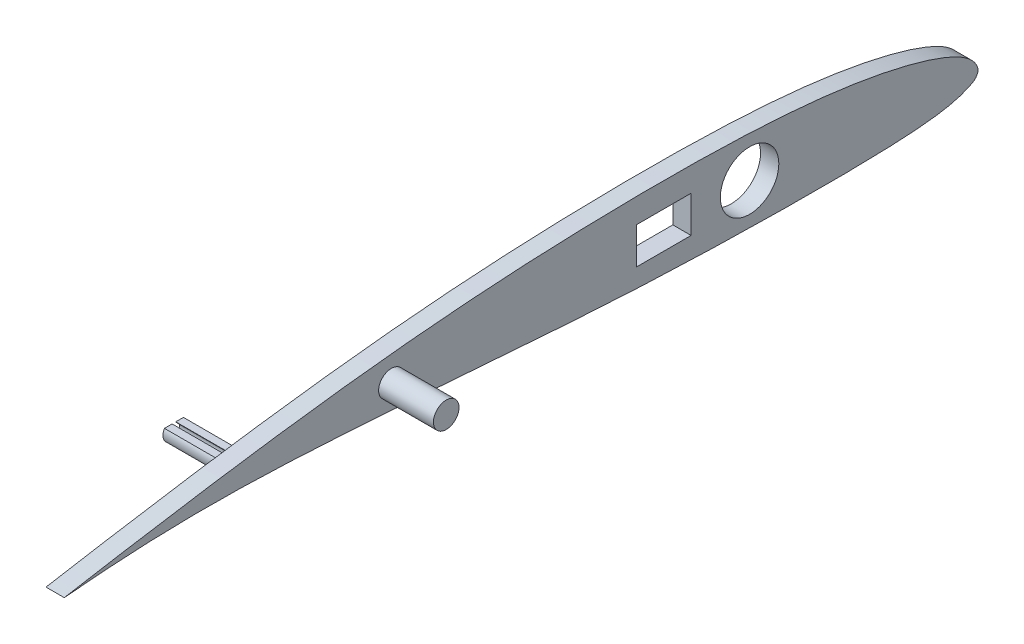
ISO-10303-21;
HEADER;
FILE_DESCRIPTION(('STEP AP214'),'2;1');
FILE_NAME('part.step','',(''),(''),'','','');
FILE_SCHEMA(('AUTOMOTIVE_DESIGN { 1 0 10303 214 1 1 1 1 }'));
ENDSEC;
DATA;
#1=APPLICATION_CONTEXT('core data for automotive mechanical design processes');
#2=APPLICATION_PROTOCOL_DEFINITION('international standard','automotive_design',2000,#1);
#3=PRODUCT_CONTEXT('',#1,'mechanical');
#4=PRODUCT('Part','Part','',(#3));
#5=PRODUCT_RELATED_PRODUCT_CATEGORY('part','',(#4));
#6=PRODUCT_DEFINITION_FORMATION('','',#4);
#7=PRODUCT_DEFINITION_CONTEXT('part definition',#1,'design');
#8=PRODUCT_DEFINITION('design','',#6,#7);
#9=PRODUCT_DEFINITION_SHAPE('','',#8);
#10=(LENGTH_UNIT() NAMED_UNIT(*) SI_UNIT(.MILLI.,.METRE.));
#11=(NAMED_UNIT(*) PLANE_ANGLE_UNIT() SI_UNIT($,.RADIAN.));
#12=(NAMED_UNIT(*) SI_UNIT($,.STERADIAN.) SOLID_ANGLE_UNIT());
#13=UNCERTAINTY_MEASURE_WITH_UNIT(LENGTH_MEASURE(1.E-05),#10,'distance_accuracy_value','');
#14=(GEOMETRIC_REPRESENTATION_CONTEXT(3) GLOBAL_UNCERTAINTY_ASSIGNED_CONTEXT((#13)) GLOBAL_UNIT_ASSIGNED_CONTEXT((#10,
#11,#12)) REPRESENTATION_CONTEXT('',''));
#15=CARTESIAN_POINT('',(0.,0.,0.));
#16=DIRECTION('',(0.,0.,1.));
#17=DIRECTION('',(1.,0.,0.));
#18=AXIS2_PLACEMENT_3D('',#15,#16,#17);
#19=CARTESIAN_POINT('',(5.,1.49711132773622,0.435092083404368));
#20=DIRECTION('',(-1.,0.,0.));
#21=DIRECTION('',(0.,0.,1.));
#22=AXIS2_PLACEMENT_3D('',#19,#20,#21);
#23=PLANE('',#22);
#24=CARTESIAN_POINT('',(5.,6.07732270373844,160.499919709394));
#25=DIRECTION('',(-1.,0.,0.));
#26=DIRECTION('',(0.,0.,1.));
#27=AXIS2_PLACEMENT_3D('',#24,#25,#26);
#28=CIRCLE('',#27,3.49999999999999);
#29=CARTESIAN_POINT('',(5.,6.07732270373844,163.999919709394));
#30=VERTEX_POINT('',#29);
#31=EDGE_CURVE('E228',#30,#30,#28,.T.);
#32=ORIENTED_EDGE('',*,*,#31,.T.);
#33=EDGE_LOOP('',(#32));
#34=FACE_BOUND('',#33,.T.);
#35=CARTESIAN_POINT('',(5.,5.07732270373844,62.4999197093942));
#36=DIRECTION('',(1.,0.,0.));
#37=DIRECTION('',(0.,0.,-1.));
#38=AXIS2_PLACEMENT_3D('',#35,#36,#37);
#39=CIRCLE('',#38,8.);
#40=CARTESIAN_POINT('',(5.,5.07732270373844,54.4999197093942));
#41=VERTEX_POINT('',#40);
#42=EDGE_CURVE('E263',#41,#41,#39,.T.);
#43=ORIENTED_EDGE('',*,*,#42,.F.);
#44=EDGE_LOOP('',(#43));
#45=FACE_BOUND('',#44,.T.);
#46=CARTESIAN_POINT('',(5.,0.,250.));
#47=CARTESIAN_POINT('',(5.,-0.0080427959719715,250.000228293678));
#48=CARTESIAN_POINT('',(5.,0.172375657967406,248.284955515532));
#49=CARTESIAN_POINT('',(5.,0.308690014795419,246.518112419387));
#50=CARTESIAN_POINT('',(5.,0.685693593852336,242.189387343398));
#51=CARTESIAN_POINT('',(5.,1.07410152891603,236.806461263496));
#52=CARTESIAN_POINT('',(5.,1.49731723995003,229.680385951639));
#53=CARTESIAN_POINT('',(5.,1.8232186026768,221.18415869828));
#54=CARTESIAN_POINT('',(5.,1.96762610068065,211.337618207726));
#55=CARTESIAN_POINT('',(5.,1.83322105638369,200.371188527109));
#56=CARTESIAN_POINT('',(5.,1.38960528984164,188.499913622482));
#57=CARTESIAN_POINT('',(5.,0.706014078000893,175.953687417433));
#58=CARTESIAN_POINT('',(5.,-0.160208641561513,162.931424917666));
#59=CARTESIAN_POINT('',(5.,-1.14801632724376,149.615771743617));
#60=CARTESIAN_POINT('',(5.,-2.19092490983926,136.176354994724));
#61=CARTESIAN_POINT('',(5.,-3.21958397917046,122.767140548026));
#62=CARTESIAN_POINT('',(5.,-4.15274312671142,109.520053587455));
#63=CARTESIAN_POINT('',(5.,-4.93856436487493,96.5460959745437));
#64=CARTESIAN_POINT('',(5.,-5.53683070268675,83.9408193016427));
#65=CARTESIAN_POINT('',(5.,-5.94764820461108,71.8018392906514));
#66=CARTESIAN_POINT('',(5.,-6.21845093878312,60.2452560030716));
#67=CARTESIAN_POINT('',(5.,-6.35536975583973,49.3987328907547));
#68=CARTESIAN_POINT('',(5.,-6.38138796281789,39.3972261942655));
#69=CARTESIAN_POINT('',(5.,-6.26504923032313,30.3619348419668));
#70=CARTESIAN_POINT('',(5.,-6.01216491688521,22.4121811031587));
#71=CARTESIAN_POINT('',(5.,-5.59743390072595,15.6262272306516));
#72=CARTESIAN_POINT('',(5.,-4.92870657935606,10.0719075109048));
#73=CARTESIAN_POINT('',(5.,-4.04044698146404,5.69769261214423));
#74=CARTESIAN_POINT('',(5.,-2.8657529844069,2.62532063874475));
#75=CARTESIAN_POINT('',(5.,-1.7115284699546,0.494884225045661));
#76=CARTESIAN_POINT('',(5.,-0.410454230626488,-0.0213125491030087));
#77=CARTESIAN_POINT('',(5.,0.792659826704065,0.0311691995850224));
#78=CARTESIAN_POINT('',(5.,2.30568433693192,0.812599241892923));
#79=CARTESIAN_POINT('',(5.,4.23835242447377,2.72886351673443));
#80=CARTESIAN_POINT('',(5.,6.11817212106947,5.76990724125498));
#81=CARTESIAN_POINT('',(5.,7.91359420170391,9.88094280419771));
#82=CARTESIAN_POINT('',(5.,9.64131817838287,15.0749304677094));
#83=CARTESIAN_POINT('',(5.,11.2838964878058,21.2987522216172));
#84=CARTESIAN_POINT('',(5.,12.7883817585812,28.4971721202648));
#85=CARTESIAN_POINT('',(5.,14.0978349081275,36.6073734062479));
#86=CARTESIAN_POINT('',(5.,15.1594290171638,45.573028440303));
#87=CARTESIAN_POINT('',(5.,15.9609039979753,55.3329100744701));
#88=CARTESIAN_POINT('',(5.,16.4940697383882,65.8165364983871));
#89=CARTESIAN_POINT('',(5.,16.7919897051422,76.9313762604552));
#90=CARTESIAN_POINT('',(5.,16.864754130909,88.5669490281142));
#91=CARTESIAN_POINT('',(5.,16.7267152914356,100.596999885542));
#92=CARTESIAN_POINT('',(5.,16.3833850637257,112.888825982424));
#93=CARTESIAN_POINT('',(5.,15.825573666627,125.31161581915));
#94=CARTESIAN_POINT('',(5.,15.0523318700684,137.743791097076));
#95=CARTESIAN_POINT('',(5.,14.0593390742259,150.072384382085));
#96=CARTESIAN_POINT('',(5.,12.8815869860292,162.191375055682));
#97=CARTESIAN_POINT('',(5.,11.5492803460744,173.989074322246));
#98=CARTESIAN_POINT('',(5.,10.1162497290333,185.35236444642));
#99=CARTESIAN_POINT('',(5.,8.63237912523508,196.163081697706));
#100=CARTESIAN_POINT('',(5.,7.13151388385034,206.300441402258));
#101=CARTESIAN_POINT('',(5.,5.73122176805054,215.560350587015));
#102=CARTESIAN_POINT('',(5.,4.29329512716244,223.97715704258));
#103=CARTESIAN_POINT('',(5.,3.1818088737293,231.363413336396));
#104=CARTESIAN_POINT('',(5.,2.09894241729889,237.746440904332));
#105=CARTESIAN_POINT('',(5.,1.2458619166603,242.622069365861));
#106=CARTESIAN_POINT('',(5.,0.552864946230777,246.64452933247));
#107=CARTESIAN_POINT('',(5.,0.246216764640028,248.328398440367));
#108=CARTESIAN_POINT('',(5.,0.00797737724443801,249.999773563223));
#109=CARTESIAN_POINT('',(5.,0.,250.));
#110=B_SPLINE_CURVE_WITH_KNOTS('',3,(#46,#47,#48,#49,#50,#51,#52,#53,#54,#55,#56,#57,#58,#59,
#60,#61,#62,#63,#64,#65,#66,#67,#68,#69,#70,#71,#72,#73,#74,#75,#76,#77,#78,#79,#80,#81,#82,#83,
#84,#85,#86,#87,#88,#89,#90,#91,#92,#93,#94,#95,#96,#97,#98,#99,#100,#101,#102,#103,#104,#105,
#106,#107,#108,#109),.UNSPECIFIED.,.T.,.F.,(4,1,1,1,1,1,1,1,1,1,1,1,1,1,1,1,1,1,1,1,1,1,1,1,1,1,
1,1,1,1,1,1,1,1,1,1,1,1,1,1,1,1,1,1,1,1,1,1,1,1,1,1,1,1,1,1,1,1,1,1,1,4),(0.,
0.00158888881614516,0.00632921783555629,0.0142024564897436,0.0251728077530557,
0.0391734833267743,0.0560606311759249,0.0755789238487882,0.0973636066296903,0.120926258366677,
0.145825281006277,0.171670911815127,0.198108536705041,0.22479018357162,0.25139057978404,
0.277643490654311,0.303326750051388,0.328257458029316,0.352272548115194,0.375156061746876,
0.396620664402003,0.416422729294005,0.434304420097656,0.450054679859308,0.463465465082325,
0.474478994238096,0.483169222153171,0.489678354497499,0.494104066315722,0.496910015324886,
0.497289784891853,0.501214273282496,0.506457950332762,0.51335695674223,0.522168631834455,
0.53296596992453,0.545689209241574,0.56022077890382,0.57643892310517,0.594258689005965,
0.613600244568652,0.634342385932902,0.656331109263004,0.679351893859712,0.703152302846811,
0.727478208080039,0.7520707394079,0.776691163534608,0.801140183976245,0.825214386971546,
0.848697423570622,0.871352857669295,0.892947448931157,0.913230871058069,0.931955467148994,
0.94834206907442,0.963693004275676,0.976235918239566,0.986320058750392,0.993788799349345,
0.998424034933867,1.),.UNSPECIFIED.);
#111=CARTESIAN_POINT('',(5.,0.,250.));
#112=VERTEX_POINT('',#111);
#113=EDGE_CURVE('E268',#112,#112,#110,.T.);
#114=ORIENTED_EDGE('',*,*,#113,.T.);
#115=EDGE_LOOP('',(#114));
#116=FACE_BOUND('',#115,.T.);
#117=DIRECTION('',(0.,1.,0.));
#118=VECTOR('',#117,1.);
#119=CARTESIAN_POINT('',(5.,10.0773227037384,78.4999197093942));
#120=LINE('',#119,#118);
#121=CARTESIAN_POINT('',(5.,0.0773227037384437,78.4999197093942));
#122=VERTEX_POINT('',#121);
#123=CARTESIAN_POINT('',(5.,10.0773227037384,78.4999197093942));
#124=VERTEX_POINT('',#123);
#125=EDGE_CURVE('E232',#122,#124,#120,.T.);
#126=ORIENTED_EDGE('',*,*,#125,.F.);
#127=DIRECTION('',(0.,0.,-1.));
#128=VECTOR('',#127,1.);
#129=CARTESIAN_POINT('',(5.,0.0773227037384437,78.4999197093942));
#130=LINE('',#129,#128);
#131=CARTESIAN_POINT('',(5.,0.0773227037384437,93.4999197093942));
#132=VERTEX_POINT('',#131);
#133=EDGE_CURVE('E240',#132,#122,#130,.T.);
#134=ORIENTED_EDGE('',*,*,#133,.F.);
#135=DIRECTION('',(0.,-1.,0.));
#136=VECTOR('',#135,1.);
#137=CARTESIAN_POINT('',(5.,10.0773227037384,93.4999197093942));
#138=LINE('',#137,#136);
#139=CARTESIAN_POINT('',(5.,10.0773227037384,93.4999197093942));
#140=VERTEX_POINT('',#139);
#141=EDGE_CURVE('E237',#140,#132,#138,.T.);
#142=ORIENTED_EDGE('',*,*,#141,.F.);
#143=DIRECTION('',(0.,0.,1.));
#144=VECTOR('',#143,1.);
#145=CARTESIAN_POINT('',(5.,10.0773227037384,78.4999197093942));
#146=LINE('',#145,#144);
#147=EDGE_CURVE('E234',#124,#140,#146,.T.);
#148=ORIENTED_EDGE('',*,*,#147,.F.);
#149=EDGE_LOOP('',(#126,#134,#142,#148));
#150=FACE_BOUND('',#149,.T.);
#151=ADVANCED_FACE('F32',(#34,#45,#116,#150),#23,.F.);
#152=CARTESIAN_POINT('',(0.,1.49711132773622,0.435092083404368));
#153=DIRECTION('',(-1.,0.,0.));
#154=DIRECTION('',(0.,0.,1.));
#155=AXIS2_PLACEMENT_3D('',#152,#153,#154);
#156=PLANE('',#155);
#157=CARTESIAN_POINT('',(0.,4.91748058964991,200.));
#158=DIRECTION('',(-1.,0.,0.));
#159=DIRECTION('',(0.,0.,1.));
#160=AXIS2_PLACEMENT_3D('',#157,#158,#159);
#161=CIRCLE('',#160,2.99999999999999);
#162=CARTESIAN_POINT('',(0.,6.41748058964991,197.401923788647));
#163=VERTEX_POINT('',#162);
#164=CARTESIAN_POINT('',(0.,3.41748058964991,197.401923788647));
#165=VERTEX_POINT('',#164);
#166=EDGE_CURVE('E11',#163,#165,#161,.T.);
#167=ORIENTED_EDGE('',*,*,#166,.F.);
#168=DIRECTION('',(0.,0.,-1.));
#169=VECTOR('',#168,1.);
#170=CARTESIAN_POINT('',(0.,6.41748058964975,0.435092083404364));
#171=LINE('',#170,#169);
#172=CARTESIAN_POINT('',(0.,6.41748058964991,199.5));
#173=VERTEX_POINT('',#172);
#174=EDGE_CURVE('E148',#173,#163,#171,.T.);
#175=ORIENTED_EDGE('',*,*,#174,.F.);
#176=DIRECTION('',(0.,1.,0.));
#177=VECTOR('',#176,1.);
#178=CARTESIAN_POINT('',(0.,1.49711132773622,199.5));
#179=LINE('',#178,#177);
#180=CARTESIAN_POINT('',(0.,6.33169415202301,199.5));
#181=VERTEX_POINT('',#180);
#182=EDGE_CURVE('E303',#181,#173,#179,.T.);
#183=ORIENTED_EDGE('',*,*,#182,.F.);
#184=CARTESIAN_POINT('',(0.,4.91748058964991,200.));
#185=DIRECTION('',(-1.,0.,0.));
#186=DIRECTION('',(0.,0.,1.));
#187=AXIS2_PLACEMENT_3D('',#184,#185,#186);
#188=CIRCLE('',#187,1.5);
#189=CARTESIAN_POINT('',(0.,3.50326702727681,199.5));
#190=VERTEX_POINT('',#189);
#191=EDGE_CURVE('E306',#190,#181,#188,.F.);
#192=ORIENTED_EDGE('',*,*,#191,.F.);
#193=DIRECTION('',(0.,1.,0.));
#194=VECTOR('',#193,1.);
#195=CARTESIAN_POINT('',(0.,1.49711132773622,199.5));
#196=LINE('',#195,#194);
#197=CARTESIAN_POINT('',(0.,3.41748058964991,199.5));
#198=VERTEX_POINT('',#197);
#199=EDGE_CURVE('E51',#198,#190,#196,.T.);
#200=ORIENTED_EDGE('',*,*,#199,.F.);
#201=DIRECTION('',(0.,0.,1.));
#202=VECTOR('',#201,1.);
#203=CARTESIAN_POINT('',(0.,3.41748058964983,0.435092083404368));
#204=LINE('',#203,#202);
#205=EDGE_CURVE('E41',#165,#198,#204,.T.);
#206=ORIENTED_EDGE('',*,*,#205,.F.);
#207=EDGE_LOOP('',(#167,#175,#183,#192,#200,#206));
#208=FACE_BOUND('',#207,.T.);
#209=CARTESIAN_POINT('',(0.,4.91748058964991,200.));
#210=DIRECTION('',(-1.,0.,0.));
#211=DIRECTION('',(0.,0.,1.));
#212=AXIS2_PLACEMENT_3D('',#209,#210,#211);
#213=CIRCLE('',#212,2.99999999999999);
#214=CARTESIAN_POINT('',(0.,3.41748058964991,202.598076211353));
#215=VERTEX_POINT('',#214);
#216=CARTESIAN_POINT('',(0.,6.41748058964991,202.598076211353));
#217=VERTEX_POINT('',#216);
#218=EDGE_CURVE('E299',#215,#217,#213,.T.);
#219=ORIENTED_EDGE('',*,*,#218,.F.);
#220=DIRECTION('',(0.,0.,1.));
#221=VECTOR('',#220,1.);
#222=CARTESIAN_POINT('',(0.,3.41748058965,0.435092083404369));
#223=LINE('',#222,#221);
#224=CARTESIAN_POINT('',(0.,3.41748058964991,200.5));
#225=VERTEX_POINT('',#224);
#226=EDGE_CURVE('E274',#225,#215,#223,.T.);
#227=ORIENTED_EDGE('',*,*,#226,.F.);
#228=DIRECTION('',(0.,-1.,0.));
#229=VECTOR('',#228,1.);
#230=CARTESIAN_POINT('',(0.,1.49711132773622,200.5));
#231=LINE('',#230,#229);
#232=CARTESIAN_POINT('',(0.,3.50326702727682,200.5));
#233=VERTEX_POINT('',#232);
#234=EDGE_CURVE('E287',#233,#225,#231,.T.);
#235=ORIENTED_EDGE('',*,*,#234,.F.);
#236=CARTESIAN_POINT('',(0.,4.91748058964991,200.));
#237=DIRECTION('',(-1.,0.,0.));
#238=DIRECTION('',(0.,0.,1.));
#239=AXIS2_PLACEMENT_3D('',#236,#237,#238);
#240=CIRCLE('',#239,1.5);
#241=CARTESIAN_POINT('',(0.,6.331694152023,200.5));
#242=VERTEX_POINT('',#241);
#243=EDGE_CURVE('E290',#242,#233,#240,.F.);
#244=ORIENTED_EDGE('',*,*,#243,.F.);
#245=DIRECTION('',(0.,-1.,0.));
#246=VECTOR('',#245,1.);
#247=CARTESIAN_POINT('',(0.,1.49711132773622,200.5));
#248=LINE('',#247,#246);
#249=CARTESIAN_POINT('',(0.,6.41748058964991,200.5));
#250=VERTEX_POINT('',#249);
#251=EDGE_CURVE('E293',#250,#242,#248,.T.);
#252=ORIENTED_EDGE('',*,*,#251,.F.);
#253=DIRECTION('',(0.,0.,-1.));
#254=VECTOR('',#253,1.);
#255=CARTESIAN_POINT('',(0.,6.41748058965008,0.435092083404372));
#256=LINE('',#255,#254);
#257=EDGE_CURVE('E296',#217,#250,#256,.T.);
#258=ORIENTED_EDGE('',*,*,#257,.F.);
#259=EDGE_LOOP('',(#219,#227,#235,#244,#252,#258));
#260=FACE_BOUND('',#259,.T.);
#261=CARTESIAN_POINT('',(0.,0.,250.));
#262=CARTESIAN_POINT('',(0.,-0.0080427959719715,250.000228293678));
#263=CARTESIAN_POINT('',(0.,0.172375657967406,248.284955515532));
#264=CARTESIAN_POINT('',(0.,0.308690014795419,246.518112419387));
#265=CARTESIAN_POINT('',(0.,0.685693593852336,242.189387343398));
#266=CARTESIAN_POINT('',(0.,1.07410152891603,236.806461263496));
#267=CARTESIAN_POINT('',(0.,1.49731723995003,229.680385951639));
#268=CARTESIAN_POINT('',(0.,1.8232186026768,221.18415869828));
#269=CARTESIAN_POINT('',(0.,1.96762610068065,211.337618207726));
#270=CARTESIAN_POINT('',(0.,1.83322105638369,200.371188527109));
#271=CARTESIAN_POINT('',(0.,1.38960528984164,188.499913622482));
#272=CARTESIAN_POINT('',(0.,0.706014078000893,175.953687417433));
#273=CARTESIAN_POINT('',(0.,-0.160208641561513,162.931424917666));
#274=CARTESIAN_POINT('',(0.,-1.14801632724376,149.615771743617));
#275=CARTESIAN_POINT('',(0.,-2.19092490983926,136.176354994724));
#276=CARTESIAN_POINT('',(0.,-3.21958397917046,122.767140548026));
#277=CARTESIAN_POINT('',(0.,-4.15274312671142,109.520053587455));
#278=CARTESIAN_POINT('',(0.,-4.93856436487493,96.5460959745437));
#279=CARTESIAN_POINT('',(0.,-5.53683070268675,83.9408193016427));
#280=CARTESIAN_POINT('',(0.,-5.94764820461108,71.8018392906514));
#281=CARTESIAN_POINT('',(0.,-6.21845093878312,60.2452560030716));
#282=CARTESIAN_POINT('',(0.,-6.35536975583973,49.3987328907547));
#283=CARTESIAN_POINT('',(0.,-6.38138796281789,39.3972261942655));
#284=CARTESIAN_POINT('',(0.,-6.26504923032313,30.3619348419668));
#285=CARTESIAN_POINT('',(0.,-6.01216491688521,22.4121811031587));
#286=CARTESIAN_POINT('',(0.,-5.59743390072595,15.6262272306516));
#287=CARTESIAN_POINT('',(0.,-4.92870657935606,10.0719075109048));
#288=CARTESIAN_POINT('',(0.,-4.04044698146404,5.69769261214423));
#289=CARTESIAN_POINT('',(0.,-2.8657529844069,2.62532063874475));
#290=CARTESIAN_POINT('',(0.,-1.7115284699546,0.494884225045661));
#291=CARTESIAN_POINT('',(0.,-0.410454230626488,-0.0213125491030087));
#292=CARTESIAN_POINT('',(0.,0.792659826704065,0.0311691995850224));
#293=CARTESIAN_POINT('',(0.,2.30568433693192,0.812599241892923));
#294=CARTESIAN_POINT('',(0.,4.23835242447377,2.72886351673443));
#295=CARTESIAN_POINT('',(0.,6.11817212106947,5.76990724125498));
#296=CARTESIAN_POINT('',(0.,7.91359420170391,9.88094280419771));
#297=CARTESIAN_POINT('',(0.,9.64131817838287,15.0749304677094));
#298=CARTESIAN_POINT('',(0.,11.2838964878058,21.2987522216172));
#299=CARTESIAN_POINT('',(0.,12.7883817585812,28.4971721202648));
#300=CARTESIAN_POINT('',(0.,14.0978349081275,36.6073734062479));
#301=CARTESIAN_POINT('',(0.,15.1594290171638,45.573028440303));
#302=CARTESIAN_POINT('',(0.,15.9609039979753,55.3329100744701));
#303=CARTESIAN_POINT('',(0.,16.4940697383882,65.8165364983871));
#304=CARTESIAN_POINT('',(0.,16.7919897051422,76.9313762604552));
#305=CARTESIAN_POINT('',(0.,16.864754130909,88.5669490281142));
#306=CARTESIAN_POINT('',(0.,16.7267152914356,100.596999885542));
#307=CARTESIAN_POINT('',(0.,16.3833850637257,112.888825982424));
#308=CARTESIAN_POINT('',(0.,15.825573666627,125.31161581915));
#309=CARTESIAN_POINT('',(0.,15.0523318700684,137.743791097076));
#310=CARTESIAN_POINT('',(0.,14.0593390742259,150.072384382085));
#311=CARTESIAN_POINT('',(0.,12.8815869860292,162.191375055682));
#312=CARTESIAN_POINT('',(0.,11.5492803460744,173.989074322246));
#313=CARTESIAN_POINT('',(0.,10.1162497290333,185.35236444642));
#314=CARTESIAN_POINT('',(0.,8.63237912523508,196.163081697706));
#315=CARTESIAN_POINT('',(0.,7.13151388385034,206.300441402258));
#316=CARTESIAN_POINT('',(0.,5.73122176805054,215.560350587015));
#317=CARTESIAN_POINT('',(0.,4.29329512716244,223.97715704258));
#318=CARTESIAN_POINT('',(0.,3.1818088737293,231.363413336396));
#319=CARTESIAN_POINT('',(0.,2.09894241729889,237.746440904332));
#320=CARTESIAN_POINT('',(0.,1.2458619166603,242.622069365861));
#321=CARTESIAN_POINT('',(0.,0.552864946230777,246.64452933247));
#322=CARTESIAN_POINT('',(0.,0.246216764640028,248.328398440367));
#323=CARTESIAN_POINT('',(0.,0.00797737724443801,249.999773563223));
#324=CARTESIAN_POINT('',(0.,0.,250.));
#325=B_SPLINE_CURVE_WITH_KNOTS('',3,(#261,#262,#263,#264,#265,#266,#267,#268,#269,#270,#271,
#272,#273,#274,#275,#276,#277,#278,#279,#280,#281,#282,#283,#284,#285,#286,#287,#288,#289,#290,
#291,#292,#293,#294,#295,#296,#297,#298,#299,#300,#301,#302,#303,#304,#305,#306,#307,#308,#309,
#310,#311,#312,#313,#314,#315,#316,#317,#318,#319,#320,#321,#322,#323,#324),.UNSPECIFIED.,.T.,
.F.,(4,1,1,1,1,1,1,1,1,1,1,1,1,1,1,1,1,1,1,1,1,1,1,1,1,1,1,1,1,1,1,1,1,1,1,1,1,1,1,1,1,1,1,1,1,
1,1,1,1,1,1,1,1,1,1,1,1,1,1,1,1,4),(0.,0.00158888881614516,0.00632921783555629,
0.0142024564897436,0.0251728077530557,0.0391734833267743,0.0560606311759249,0.0755789238487882,
0.0973636066296903,0.120926258366677,0.145825281006277,0.171670911815127,0.198108536705041,
0.22479018357162,0.25139057978404,0.277643490654311,0.303326750051388,0.328257458029316,
0.352272548115194,0.375156061746876,0.396620664402003,0.416422729294005,0.434304420097656,
0.450054679859308,0.463465465082325,0.474478994238096,0.483169222153171,0.489678354497499,
0.494104066315722,0.496910015324886,0.497289784891853,0.501214273282496,0.506457950332762,
0.51335695674223,0.522168631834455,0.53296596992453,0.545689209241574,0.56022077890382,
0.57643892310517,0.594258689005965,0.613600244568652,0.634342385932902,0.656331109263004,
0.679351893859712,0.703152302846811,0.727478208080039,0.7520707394079,0.776691163534608,
0.801140183976245,0.825214386971546,0.848697423570622,0.871352857669295,0.892947448931157,
0.913230871058069,0.931955467148994,0.94834206907442,0.963693004275676,0.976235918239566,
0.986320058750392,0.993788799349345,0.998424034933867,1.),.UNSPECIFIED.);
#326=CARTESIAN_POINT('',(0.,0.,250.));
#327=VERTEX_POINT('',#326);
#328=EDGE_CURVE('E266',#327,#327,#325,.T.);
#329=ORIENTED_EDGE('',*,*,#328,.F.);
#330=EDGE_LOOP('',(#329));
#331=FACE_BOUND('',#330,.T.);
#332=CARTESIAN_POINT('',(0.,5.07732270373844,62.4999197093942));
#333=DIRECTION('',(1.,0.,0.));
#334=DIRECTION('',(0.,0.,-1.));
#335=AXIS2_PLACEMENT_3D('',#332,#333,#334);
#336=CIRCLE('',#335,8.);
#337=CARTESIAN_POINT('',(0.,5.07732270373844,54.4999197093942));
#338=VERTEX_POINT('',#337);
#339=EDGE_CURVE('E262',#338,#338,#336,.T.);
#340=ORIENTED_EDGE('',*,*,#339,.T.);
#341=EDGE_LOOP('',(#340));
#342=FACE_BOUND('',#341,.T.);
#343=DIRECTION('',(0.,0.,-1.));
#344=VECTOR('',#343,1.);
#345=CARTESIAN_POINT('',(0.,0.0773227037384437,78.4999197093942));
#346=LINE('',#345,#344);
#347=CARTESIAN_POINT('',(0.,0.0773227037384437,93.4999197093942));
#348=VERTEX_POINT('',#347);
#349=CARTESIAN_POINT('',(0.,0.0773227037384437,78.4999197093942));
#350=VERTEX_POINT('',#349);
#351=EDGE_CURVE('E235',#348,#350,#346,.T.);
#352=ORIENTED_EDGE('',*,*,#351,.T.);
#353=DIRECTION('',(0.,1.,0.));
#354=VECTOR('',#353,1.);
#355=CARTESIAN_POINT('',(0.,10.0773227037384,78.4999197093942));
#356=LINE('',#355,#354);
#357=CARTESIAN_POINT('',(0.,10.0773227037384,78.4999197093942));
#358=VERTEX_POINT('',#357);
#359=EDGE_CURVE('E231',#350,#358,#356,.T.);
#360=ORIENTED_EDGE('',*,*,#359,.T.);
#361=DIRECTION('',(0.,0.,1.));
#362=VECTOR('',#361,1.);
#363=CARTESIAN_POINT('',(0.,10.0773227037384,78.4999197093942));
#364=LINE('',#363,#362);
#365=CARTESIAN_POINT('',(0.,10.0773227037384,93.4999197093942));
#366=VERTEX_POINT('',#365);
#367=EDGE_CURVE('E245',#358,#366,#364,.T.);
#368=ORIENTED_EDGE('',*,*,#367,.T.);
#369=DIRECTION('',(0.,-1.,0.));
#370=VECTOR('',#369,1.);
#371=CARTESIAN_POINT('',(0.,10.0773227037384,93.4999197093942));
#372=LINE('',#371,#370);
#373=EDGE_CURVE('E248',#366,#348,#372,.T.);
#374=ORIENTED_EDGE('',*,*,#373,.T.);
#375=EDGE_LOOP('',(#352,#360,#368,#374));
#376=FACE_BOUND('',#375,.T.);
#377=ADVANCED_FACE('F318',(#208,#260,#331,#342,#376),#156,.T.);
#378=DIRECTION('',(-1.,0.,0.));
#379=VECTOR('',#378,1.);
#380=SURFACE_OF_LINEAR_EXTRUSION('',#110,#379);
#381=ORIENTED_EDGE('',*,*,#113,.F.);
#382=EDGE_LOOP('',(#381));
#383=FACE_BOUND('',#382,.T.);
#384=ORIENTED_EDGE('',*,*,#328,.T.);
#385=EDGE_LOOP('',(#384));
#386=FACE_BOUND('',#385,.T.);
#387=ADVANCED_FACE('F34',(#383,#386),#380,.F.);
#388=CARTESIAN_POINT('',(5.,5.07732270373844,62.4999197093942));
#389=DIRECTION('',(-1.,0.,0.));
#390=DIRECTION('',(0.,0.,1.));
#391=AXIS2_PLACEMENT_3D('',#388,#389,#390);
#392=CYLINDRICAL_SURFACE('',#391,8.);
#393=ORIENTED_EDGE('',*,*,#42,.T.);
#394=EDGE_LOOP('',(#393));
#395=FACE_BOUND('',#394,.T.);
#396=ORIENTED_EDGE('',*,*,#339,.F.);
#397=EDGE_LOOP('',(#396));
#398=FACE_BOUND('',#397,.T.);
#399=ADVANCED_FACE('F360',(#395,#398),#392,.F.);
#400=CARTESIAN_POINT('',(5.,10.0773227037384,78.4999197093942));
#401=DIRECTION('',(0.,0.,1.));
#402=DIRECTION('',(1.,0.,0.));
#403=AXIS2_PLACEMENT_3D('',#400,#401,#402);
#404=PLANE('',#403);
#405=ORIENTED_EDGE('',*,*,#359,.F.);
#406=DIRECTION('',(-1.,0.,0.));
#407=VECTOR('',#406,1.);
#408=CARTESIAN_POINT('',(5.,0.0773227037384437,78.4999197093942));
#409=LINE('',#408,#407);
#410=EDGE_CURVE('E242',#122,#350,#409,.T.);
#411=ORIENTED_EDGE('',*,*,#410,.F.);
#412=ORIENTED_EDGE('',*,*,#125,.T.);
#413=DIRECTION('',(-1.,0.,0.));
#414=VECTOR('',#413,1.);
#415=CARTESIAN_POINT('',(5.,10.0773227037384,78.4999197093942));
#416=LINE('',#415,#414);
#417=EDGE_CURVE('E259',#124,#358,#416,.T.);
#418=ORIENTED_EDGE('',*,*,#417,.T.);
#419=EDGE_LOOP('',(#405,#411,#412,#418));
#420=FACE_BOUND('',#419,.T.);
#421=ADVANCED_FACE('F334',(#420),#404,.T.);
#422=CARTESIAN_POINT('',(5.,10.0773227037384,78.4999197093942));
#423=DIRECTION('',(0.,-1.,0.));
#424=DIRECTION('',(0.,0.,-1.));
#425=AXIS2_PLACEMENT_3D('',#422,#423,#424);
#426=PLANE('',#425);
#427=ORIENTED_EDGE('',*,*,#367,.F.);
#428=ORIENTED_EDGE('',*,*,#417,.F.);
#429=ORIENTED_EDGE('',*,*,#147,.T.);
#430=DIRECTION('',(-1.,0.,0.));
#431=VECTOR('',#430,1.);
#432=CARTESIAN_POINT('',(5.,10.0773227037384,93.4999197093942));
#433=LINE('',#432,#431);
#434=EDGE_CURVE('E257',#140,#366,#433,.T.);
#435=ORIENTED_EDGE('',*,*,#434,.T.);
#436=EDGE_LOOP('',(#427,#428,#429,#435));
#437=FACE_BOUND('',#436,.T.);
#438=ADVANCED_FACE('F341',(#437),#426,.T.);
#439=CARTESIAN_POINT('',(5.,10.0773227037384,93.4999197093942));
#440=DIRECTION('',(0.,0.,-1.));
#441=DIRECTION('',(-1.,0.,0.));
#442=AXIS2_PLACEMENT_3D('',#439,#440,#441);
#443=PLANE('',#442);
#444=ORIENTED_EDGE('',*,*,#373,.F.);
#445=ORIENTED_EDGE('',*,*,#434,.F.);
#446=ORIENTED_EDGE('',*,*,#141,.T.);
#447=DIRECTION('',(-1.,0.,0.));
#448=VECTOR('',#447,1.);
#449=CARTESIAN_POINT('',(5.,0.0773227037384437,93.4999197093942));
#450=LINE('',#449,#448);
#451=EDGE_CURVE('E255',#132,#348,#450,.T.);
#452=ORIENTED_EDGE('',*,*,#451,.T.);
#453=EDGE_LOOP('',(#444,#445,#446,#452));
#454=FACE_BOUND('',#453,.T.);
#455=ADVANCED_FACE('F343',(#454),#443,.T.);
#456=CARTESIAN_POINT('',(5.,0.0773227037384437,78.4999197093942));
#457=DIRECTION('',(0.,1.,0.));
#458=DIRECTION('',(0.,0.,1.));
#459=AXIS2_PLACEMENT_3D('',#456,#457,#458);
#460=PLANE('',#459);
#461=ORIENTED_EDGE('',*,*,#351,.F.);
#462=ORIENTED_EDGE('',*,*,#451,.F.);
#463=ORIENTED_EDGE('',*,*,#133,.T.);
#464=ORIENTED_EDGE('',*,*,#410,.T.);
#465=EDGE_LOOP('',(#461,#462,#463,#464));
#466=FACE_BOUND('',#465,.T.);
#467=ADVANCED_FACE('F329',(#466),#460,.T.);
#468=CARTESIAN_POINT('',(20.,6.07732270373844,160.499919709394));
#469=DIRECTION('',(-1.,0.,0.));
#470=DIRECTION('',(0.,0.,1.));
#471=AXIS2_PLACEMENT_3D('',#468,#469,#470);
#472=CYLINDRICAL_SURFACE('',#471,3.49999999999999);
#473=CARTESIAN_POINT('',(20.,6.07732270373844,160.499919709394));
#474=DIRECTION('',(-1.,0.,0.));
#475=DIRECTION('',(0.,0.,1.));
#476=AXIS2_PLACEMENT_3D('',#473,#474,#475);
#477=CIRCLE('',#476,3.49999999999999);
#478=CARTESIAN_POINT('',(20.,6.07732270373844,163.999919709394));
#479=VERTEX_POINT('',#478);
#480=EDGE_CURVE('E211',#479,#479,#477,.T.);
#481=ORIENTED_EDGE('',*,*,#480,.T.);
#482=EDGE_LOOP('',(#481));
#483=FACE_BOUND('',#482,.T.);
#484=ORIENTED_EDGE('',*,*,#31,.F.);
#485=EDGE_LOOP('',(#484));
#486=FACE_BOUND('',#485,.T.);
#487=ADVANCED_FACE('F350',(#483,#486),#472,.T.);
#488=CARTESIAN_POINT('',(20.,6.07732270373844,160.499919709394));
#489=DIRECTION('',(-1.,0.,0.));
#490=DIRECTION('',(0.,0.,1.));
#491=AXIS2_PLACEMENT_3D('',#488,#489,#490);
#492=PLANE('',#491);
#493=ORIENTED_EDGE('',*,*,#480,.F.);
#494=EDGE_LOOP('',(#493));
#495=FACE_BOUND('',#494,.T.);
#496=ADVANCED_FACE('F393',(#495),#492,.F.);
#497=CARTESIAN_POINT('',(-15.,4.91748058964991,200.));
#498=DIRECTION('',(1.,0.,0.));
#499=DIRECTION('',(0.,0.,-1.));
#500=AXIS2_PLACEMENT_3D('',#497,#498,#499);
#501=CYLINDRICAL_SURFACE('',#500,2.99999999999999);
#502=DIRECTION('',(1.,0.,0.));
#503=VECTOR('',#502,1.);
#504=CARTESIAN_POINT('',(-15.,3.41748058964991,202.598076211353));
#505=LINE('',#504,#503);
#506=CARTESIAN_POINT('',(-15.,3.41748058964991,202.598076211353));
#507=VERTEX_POINT('',#506);
#508=EDGE_CURVE('E207',#507,#215,#505,.T.);
#509=ORIENTED_EDGE('',*,*,#508,.T.);
#510=ORIENTED_EDGE('',*,*,#218,.T.);
#511=DIRECTION('',(1.,0.,0.));
#512=VECTOR('',#511,1.);
#513=CARTESIAN_POINT('',(-15.,6.41748058964991,202.598076211353));
#514=LINE('',#513,#512);
#515=CARTESIAN_POINT('',(-15.,6.41748058964991,202.598076211353));
#516=VERTEX_POINT('',#515);
#517=EDGE_CURVE('E208',#516,#217,#514,.T.);
#518=ORIENTED_EDGE('',*,*,#517,.F.);
#519=CARTESIAN_POINT('',(-15.,4.91748058964991,200.));
#520=DIRECTION('',(1.,0.,0.));
#521=DIRECTION('',(0.,0.,-1.));
#522=AXIS2_PLACEMENT_3D('',#519,#520,#521);
#523=CIRCLE('',#522,2.99999999999999);
#524=EDGE_CURVE('E179',#516,#507,#523,.T.);
#525=ORIENTED_EDGE('',*,*,#524,.T.);
#526=EDGE_LOOP('',(#509,#510,#518,#525));
#527=FACE_BOUND('',#526,.T.);
#528=ADVANCED_FACE('F402',(#527),#501,.T.);
#529=CARTESIAN_POINT('',(-15.,6.41748058964991,200.5));
#530=DIRECTION('',(0.,1.,0.));
#531=DIRECTION('',(0.,0.,1.));
#532=AXIS2_PLACEMENT_3D('',#529,#530,#531);
#533=PLANE('',#532);
#534=ORIENTED_EDGE('',*,*,#517,.T.);
#535=ORIENTED_EDGE('',*,*,#257,.T.);
#536=DIRECTION('',(1.,0.,0.));
#537=VECTOR('',#536,1.);
#538=CARTESIAN_POINT('',(-15.,6.41748058964991,200.5));
#539=LINE('',#538,#537);
#540=CARTESIAN_POINT('',(-15.,6.41748058964991,200.5));
#541=VERTEX_POINT('',#540);
#542=EDGE_CURVE('E212',#541,#250,#539,.T.);
#543=ORIENTED_EDGE('',*,*,#542,.F.);
#544=DIRECTION('',(0.,0.,1.));
#545=VECTOR('',#544,1.);
#546=CARTESIAN_POINT('',(-15.,6.41748058964991,200.5));
#547=LINE('',#546,#545);
#548=EDGE_CURVE('E204',#541,#516,#547,.T.);
#549=ORIENTED_EDGE('',*,*,#548,.T.);
#550=EDGE_LOOP('',(#534,#535,#543,#549));
#551=FACE_BOUND('',#550,.T.);
#552=ADVANCED_FACE('F424',(#551),#533,.T.);
#553=CARTESIAN_POINT('',(-15.,6.41748058964991,200.5));
#554=DIRECTION('',(0.,0.,-1.));
#555=DIRECTION('',(-1.,0.,0.));
#556=AXIS2_PLACEMENT_3D('',#553,#554,#555);
#557=PLANE('',#556);
#558=ORIENTED_EDGE('',*,*,#542,.T.);
#559=ORIENTED_EDGE('',*,*,#251,.T.);
#560=DIRECTION('',(1.,0.,0.));
#561=VECTOR('',#560,1.);
#562=CARTESIAN_POINT('',(-15.,6.331694152023,200.5));
#563=LINE('',#562,#561);
#564=CARTESIAN_POINT('',(-15.,6.331694152023,200.5));
#565=VERTEX_POINT('',#564);
#566=EDGE_CURVE('E215',#565,#242,#563,.T.);
#567=ORIENTED_EDGE('',*,*,#566,.F.);
#568=DIRECTION('',(0.,1.,0.));
#569=VECTOR('',#568,1.);
#570=CARTESIAN_POINT('',(-15.,6.41748058964991,200.5));
#571=LINE('',#570,#569);
#572=EDGE_CURVE('E201',#565,#541,#571,.T.);
#573=ORIENTED_EDGE('',*,*,#572,.T.);
#574=EDGE_LOOP('',(#558,#559,#567,#573));
#575=FACE_BOUND('',#574,.T.);
#576=ADVANCED_FACE('F434',(#575),#557,.T.);
#577=CARTESIAN_POINT('',(-15.,4.91748058964991,200.));
#578=DIRECTION('',(1.,0.,0.));
#579=DIRECTION('',(0.,0.,-1.));
#580=AXIS2_PLACEMENT_3D('',#577,#578,#579);
#581=CYLINDRICAL_SURFACE('',#580,1.5);
#582=ORIENTED_EDGE('',*,*,#566,.T.);
#583=ORIENTED_EDGE('',*,*,#243,.T.);
#584=DIRECTION('',(1.,0.,0.));
#585=VECTOR('',#584,1.);
#586=CARTESIAN_POINT('',(-15.,3.50326702727682,200.5));
#587=LINE('',#586,#585);
#588=CARTESIAN_POINT('',(-15.,3.50326702727682,200.5));
#589=VERTEX_POINT('',#588);
#590=EDGE_CURVE('E218',#589,#233,#587,.T.);
#591=ORIENTED_EDGE('',*,*,#590,.F.);
#592=CARTESIAN_POINT('',(-15.,4.91748058964991,200.));
#593=DIRECTION('',(-1.,0.,0.));
#594=DIRECTION('',(0.,0.,-1.));
#595=AXIS2_PLACEMENT_3D('',#592,#593,#594);
#596=CIRCLE('',#595,1.5);
#597=EDGE_CURVE('E198',#589,#565,#596,.T.);
#598=ORIENTED_EDGE('',*,*,#597,.T.);
#599=EDGE_LOOP('',(#582,#583,#591,#598));
#600=FACE_BOUND('',#599,.T.);
#601=ADVANCED_FACE('F444',(#600),#581,.F.);
#602=CARTESIAN_POINT('',(-15.,3.50326702727682,200.5));
#603=DIRECTION('',(0.,0.,-1.));
#604=DIRECTION('',(-1.,0.,0.));
#605=AXIS2_PLACEMENT_3D('',#602,#603,#604);
#606=PLANE('',#605);
#607=ORIENTED_EDGE('',*,*,#590,.T.);
#608=ORIENTED_EDGE('',*,*,#234,.T.);
#609=DIRECTION('',(1.,0.,0.));
#610=VECTOR('',#609,1.);
#611=CARTESIAN_POINT('',(-15.,3.41748058964991,200.5));
#612=LINE('',#611,#610);
#613=CARTESIAN_POINT('',(-15.,3.41748058964991,200.5));
#614=VERTEX_POINT('',#613);
#615=EDGE_CURVE('E221',#614,#225,#612,.T.);
#616=ORIENTED_EDGE('',*,*,#615,.F.);
#617=DIRECTION('',(0.,1.,0.));
#618=VECTOR('',#617,1.);
#619=CARTESIAN_POINT('',(-15.,3.50326702727682,200.5));
#620=LINE('',#619,#618);
#621=EDGE_CURVE('E195',#614,#589,#620,.T.);
#622=ORIENTED_EDGE('',*,*,#621,.T.);
#623=EDGE_LOOP('',(#607,#608,#616,#622));
#624=FACE_BOUND('',#623,.T.);
#625=ADVANCED_FACE('F454',(#624),#606,.T.);
#626=CARTESIAN_POINT('',(-15.,3.41748058964991,200.5));
#627=DIRECTION('',(0.,-1.,0.));
#628=DIRECTION('',(0.,0.,-1.));
#629=AXIS2_PLACEMENT_3D('',#626,#627,#628);
#630=PLANE('',#629);
#631=ORIENTED_EDGE('',*,*,#615,.T.);
#632=ORIENTED_EDGE('',*,*,#226,.T.);
#633=ORIENTED_EDGE('',*,*,#508,.F.);
#634=DIRECTION('',(0.,0.,-1.));
#635=VECTOR('',#634,1.);
#636=CARTESIAN_POINT('',(-15.,3.41748058964991,200.5));
#637=LINE('',#636,#635);
#638=EDGE_CURVE('E192',#507,#614,#637,.T.);
#639=ORIENTED_EDGE('',*,*,#638,.T.);
#640=EDGE_LOOP('',(#631,#632,#633,#639));
#641=FACE_BOUND('',#640,.T.);
#642=ADVANCED_FACE('F464',(#641),#630,.T.);
#643=CARTESIAN_POINT('',(-15.,4.91748058964991,200.));
#644=DIRECTION('',(1.,0.,0.));
#645=DIRECTION('',(0.,0.,-1.));
#646=AXIS2_PLACEMENT_3D('',#643,#644,#645);
#647=PLANE('',#646);
#648=ORIENTED_EDGE('',*,*,#524,.F.);
#649=ORIENTED_EDGE('',*,*,#548,.F.);
#650=ORIENTED_EDGE('',*,*,#572,.F.);
#651=ORIENTED_EDGE('',*,*,#597,.F.);
#652=ORIENTED_EDGE('',*,*,#621,.F.);
#653=ORIENTED_EDGE('',*,*,#638,.F.);
#654=EDGE_LOOP('',(#648,#649,#650,#651,#652,#653));
#655=FACE_BOUND('',#654,.T.);
#656=ADVANCED_FACE('F474',(#655),#647,.F.);
#657=CARTESIAN_POINT('',(-15.,4.91748058964991,200.));
#658=DIRECTION('',(1.,0.,0.));
#659=DIRECTION('',(0.,0.,-1.));
#660=AXIS2_PLACEMENT_3D('',#657,#658,#659);
#661=CYLINDRICAL_SURFACE('',#660,2.99999999999999);
#662=DIRECTION('',(1.,0.,0.));
#663=VECTOR('',#662,1.);
#664=CARTESIAN_POINT('',(-15.,6.41748058964991,197.401923788647));
#665=LINE('',#664,#663);
#666=CARTESIAN_POINT('',(-15.,6.41748058964991,197.401923788647));
#667=VERTEX_POINT('',#666);
#668=EDGE_CURVE('E143',#667,#163,#665,.T.);
#669=ORIENTED_EDGE('',*,*,#668,.T.);
#670=ORIENTED_EDGE('',*,*,#166,.T.);
#671=DIRECTION('',(1.,0.,0.));
#672=VECTOR('',#671,1.);
#673=CARTESIAN_POINT('',(-15.,3.41748058964991,197.401923788647));
#674=LINE('',#673,#672);
#675=CARTESIAN_POINT('',(-15.,3.41748058964991,197.401923788647));
#676=VERTEX_POINT('',#675);
#677=EDGE_CURVE('E167',#676,#165,#674,.T.);
#678=ORIENTED_EDGE('',*,*,#677,.F.);
#679=CARTESIAN_POINT('',(-15.,4.91748058964991,200.));
#680=DIRECTION('',(1.,0.,0.));
#681=DIRECTION('',(0.,0.,-1.));
#682=AXIS2_PLACEMENT_3D('',#679,#680,#681);
#683=CIRCLE('',#682,2.99999999999999);
#684=EDGE_CURVE('E159',#676,#667,#683,.T.);
#685=ORIENTED_EDGE('',*,*,#684,.T.);
#686=EDGE_LOOP('',(#669,#670,#678,#685));
#687=FACE_BOUND('',#686,.T.);
#688=ADVANCED_FACE('F165',(#687),#661,.T.);
#689=CARTESIAN_POINT('',(-15.,3.41748058964991,197.401923788647));
#690=DIRECTION('',(0.,-1.,0.));
#691=DIRECTION('',(0.,0.,-1.));
#692=AXIS2_PLACEMENT_3D('',#689,#690,#691);
#693=PLANE('',#692);
#694=ORIENTED_EDGE('',*,*,#677,.T.);
#695=ORIENTED_EDGE('',*,*,#205,.T.);
#696=DIRECTION('',(1.,0.,0.));
#697=VECTOR('',#696,1.);
#698=CARTESIAN_POINT('',(-15.,3.41748058964991,199.5));
#699=LINE('',#698,#697);
#700=CARTESIAN_POINT('',(-15.,3.41748058964991,199.5));
#701=VERTEX_POINT('',#700);
#702=EDGE_CURVE('E180',#701,#198,#699,.T.);
#703=ORIENTED_EDGE('',*,*,#702,.F.);
#704=DIRECTION('',(0.,0.,-1.));
#705=VECTOR('',#704,1.);
#706=CARTESIAN_POINT('',(-15.,3.41748058964991,197.401923788647));
#707=LINE('',#706,#705);
#708=EDGE_CURVE('E152',#701,#676,#707,.T.);
#709=ORIENTED_EDGE('',*,*,#708,.T.);
#710=EDGE_LOOP('',(#694,#695,#703,#709));
#711=FACE_BOUND('',#710,.T.);
#712=ADVANCED_FACE('F310',(#711),#693,.T.);
#713=CARTESIAN_POINT('',(-15.,3.50326702727681,199.5));
#714=DIRECTION('',(0.,0.,1.));
#715=DIRECTION('',(1.,0.,0.));
#716=AXIS2_PLACEMENT_3D('',#713,#714,#715);
#717=PLANE('',#716);
#718=ORIENTED_EDGE('',*,*,#702,.T.);
#719=ORIENTED_EDGE('',*,*,#199,.T.);
#720=DIRECTION('',(1.,0.,0.));
#721=VECTOR('',#720,1.);
#722=CARTESIAN_POINT('',(-15.,3.50326702727681,199.5));
#723=LINE('',#722,#721);
#724=CARTESIAN_POINT('',(-15.,3.50326702727681,199.5));
#725=VERTEX_POINT('',#724);
#726=EDGE_CURVE('E183',#725,#190,#723,.T.);
#727=ORIENTED_EDGE('',*,*,#726,.F.);
#728=DIRECTION('',(0.,-1.,0.));
#729=VECTOR('',#728,1.);
#730=CARTESIAN_POINT('',(-15.,3.50326702727681,199.5));
#731=LINE('',#730,#729);
#732=EDGE_CURVE('E174',#725,#701,#731,.T.);
#733=ORIENTED_EDGE('',*,*,#732,.T.);
#734=EDGE_LOOP('',(#718,#719,#727,#733));
#735=FACE_BOUND('',#734,.T.);
#736=ADVANCED_FACE('F312',(#735),#717,.T.);
#737=CARTESIAN_POINT('',(-15.,4.91748058964991,200.));
#738=DIRECTION('',(1.,0.,0.));
#739=DIRECTION('',(0.,0.,-1.));
#740=AXIS2_PLACEMENT_3D('',#737,#738,#739);
#741=CYLINDRICAL_SURFACE('',#740,1.5);
#742=ORIENTED_EDGE('',*,*,#726,.T.);
#743=ORIENTED_EDGE('',*,*,#191,.T.);
#744=DIRECTION('',(1.,0.,0.));
#745=VECTOR('',#744,1.);
#746=CARTESIAN_POINT('',(-15.,6.33169415202301,199.5));
#747=LINE('',#746,#745);
#748=CARTESIAN_POINT('',(-15.,6.33169415202301,199.5));
#749=VERTEX_POINT('',#748);
#750=EDGE_CURVE('E186',#749,#181,#747,.T.);
#751=ORIENTED_EDGE('',*,*,#750,.F.);
#752=CARTESIAN_POINT('',(-15.,4.91748058964991,200.));
#753=DIRECTION('',(-1.,0.,0.));
#754=DIRECTION('',(0.,0.,-1.));
#755=AXIS2_PLACEMENT_3D('',#752,#753,#754);
#756=CIRCLE('',#755,1.5);
#757=EDGE_CURVE('E171',#749,#725,#756,.T.);
#758=ORIENTED_EDGE('',*,*,#757,.T.);
#759=EDGE_LOOP('',(#742,#743,#751,#758));
#760=FACE_BOUND('',#759,.T.);
#761=ADVANCED_FACE('F315',(#760),#741,.F.);
#762=CARTESIAN_POINT('',(-15.,6.41748058964991,199.5));
#763=DIRECTION('',(0.,0.,1.));
#764=DIRECTION('',(1.,0.,0.));
#765=AXIS2_PLACEMENT_3D('',#762,#763,#764);
#766=PLANE('',#765);
#767=ORIENTED_EDGE('',*,*,#750,.T.);
#768=ORIENTED_EDGE('',*,*,#182,.T.);
#769=DIRECTION('',(1.,0.,0.));
#770=VECTOR('',#769,1.);
#771=CARTESIAN_POINT('',(-15.,6.41748058964991,199.5));
#772=LINE('',#771,#770);
#773=CARTESIAN_POINT('',(-15.,6.41748058964991,199.5));
#774=VERTEX_POINT('',#773);
#775=EDGE_CURVE('E151',#774,#173,#772,.T.);
#776=ORIENTED_EDGE('',*,*,#775,.F.);
#777=DIRECTION('',(0.,-1.,0.));
#778=VECTOR('',#777,1.);
#779=CARTESIAN_POINT('',(-15.,6.41748058964991,199.5));
#780=LINE('',#779,#778);
#781=EDGE_CURVE('E163',#774,#749,#780,.T.);
#782=ORIENTED_EDGE('',*,*,#781,.T.);
#783=EDGE_LOOP('',(#767,#768,#776,#782));
#784=FACE_BOUND('',#783,.T.);
#785=ADVANCED_FACE('F317',(#784),#766,.T.);
#786=CARTESIAN_POINT('',(-15.,6.41748058964991,197.401923788647));
#787=DIRECTION('',(0.,1.,0.));
#788=DIRECTION('',(0.,0.,1.));
#789=AXIS2_PLACEMENT_3D('',#786,#787,#788);
#790=PLANE('',#789);
#791=ORIENTED_EDGE('',*,*,#775,.T.);
#792=ORIENTED_EDGE('',*,*,#174,.T.);
#793=ORIENTED_EDGE('',*,*,#668,.F.);
#794=DIRECTION('',(0.,0.,1.));
#795=VECTOR('',#794,1.);
#796=CARTESIAN_POINT('',(-15.,6.41748058964991,197.401923788647));
#797=LINE('',#796,#795);
#798=EDGE_CURVE('E147',#667,#774,#797,.T.);
#799=ORIENTED_EDGE('',*,*,#798,.T.);
#800=EDGE_LOOP('',(#791,#792,#793,#799));
#801=FACE_BOUND('',#800,.T.);
#802=ADVANCED_FACE('F146',(#801),#790,.T.);
#803=CARTESIAN_POINT('',(-15.,4.91748058964991,200.));
#804=DIRECTION('',(1.,0.,0.));
#805=DIRECTION('',(0.,0.,-1.));
#806=AXIS2_PLACEMENT_3D('',#803,#804,#805);
#807=PLANE('',#806);
#808=ORIENTED_EDGE('',*,*,#684,.F.);
#809=ORIENTED_EDGE('',*,*,#708,.F.);
#810=ORIENTED_EDGE('',*,*,#732,.F.);
#811=ORIENTED_EDGE('',*,*,#757,.F.);
#812=ORIENTED_EDGE('',*,*,#781,.F.);
#813=ORIENTED_EDGE('',*,*,#798,.F.);
#814=EDGE_LOOP('',(#808,#809,#810,#811,#812,#813));
#815=FACE_BOUND('',#814,.T.);
#816=ADVANCED_FACE('F157',(#815),#807,.F.);
#817=CLOSED_SHELL('',(#151,#377,#387,#399,#421,#438,#455,#467,#487,#496,#528,#552,#576,#601,
#625,#642,#656,#688,#712,#736,#761,#785,#802,#816));
#818=MANIFOLD_SOLID_BREP('B2',#817);
#819=ADVANCED_BREP_SHAPE_REPRESENTATION('',(#18,#818),#14);
#820=SHAPE_DEFINITION_REPRESENTATION(#9,#819);
ENDSEC;
END-ISO-10303-21;
